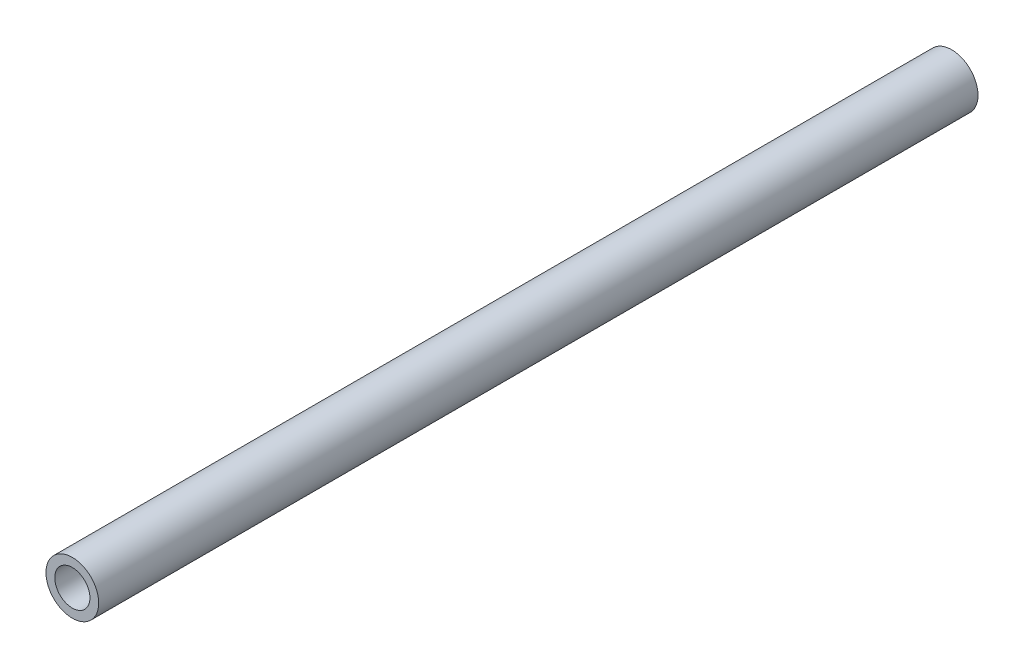
ISO-10303-21;
HEADER;
FILE_DESCRIPTION(('STEP AP214'),'2;1');
FILE_NAME('part.step','',(''),(''),'','','');
FILE_SCHEMA(('AUTOMOTIVE_DESIGN { 1 0 10303 214 1 1 1 1 }'));
ENDSEC;
DATA;
#1=APPLICATION_CONTEXT('core data for automotive mechanical design processes');
#2=APPLICATION_PROTOCOL_DEFINITION('international standard','automotive_design',2000,#1);
#3=PRODUCT_CONTEXT('',#1,'mechanical');
#4=PRODUCT('Part','Part','',(#3));
#5=PRODUCT_RELATED_PRODUCT_CATEGORY('part','',(#4));
#6=PRODUCT_DEFINITION_FORMATION('','',#4);
#7=PRODUCT_DEFINITION_CONTEXT('part definition',#1,'design');
#8=PRODUCT_DEFINITION('design','',#6,#7);
#9=PRODUCT_DEFINITION_SHAPE('','',#8);
#10=(LENGTH_UNIT() NAMED_UNIT(*) SI_UNIT(.MILLI.,.METRE.));
#11=(NAMED_UNIT(*) PLANE_ANGLE_UNIT() SI_UNIT($,.RADIAN.));
#12=(NAMED_UNIT(*) SI_UNIT($,.STERADIAN.) SOLID_ANGLE_UNIT());
#13=UNCERTAINTY_MEASURE_WITH_UNIT(LENGTH_MEASURE(1.E-05),#10,'distance_accuracy_value','');
#14=(GEOMETRIC_REPRESENTATION_CONTEXT(3) GLOBAL_UNCERTAINTY_ASSIGNED_CONTEXT((#13)) GLOBAL_UNIT_ASSIGNED_CONTEXT((#10,
#11,#12)) REPRESENTATION_CONTEXT('',''));
#15=CARTESIAN_POINT('',(0.,0.,0.));
#16=DIRECTION('',(0.,0.,1.));
#17=DIRECTION('',(1.,0.,0.));
#18=AXIS2_PLACEMENT_3D('',#15,#16,#17);
#19=CARTESIAN_POINT('',(0.,0.,100.));
#20=DIRECTION('',(0.,0.,1.));
#21=DIRECTION('',(1.,0.,0.));
#22=AXIS2_PLACEMENT_3D('',#19,#20,#21);
#23=PLANE('',#22);
#24=CARTESIAN_POINT('',(0.,0.,100.));
#25=DIRECTION('',(0.,0.,1.));
#26=DIRECTION('',(1.,0.,0.));
#27=AXIS2_PLACEMENT_3D('',#24,#25,#26);
#28=CIRCLE('',#27,3.);
#29=CARTESIAN_POINT('',(3.,0.,100.));
#30=VERTEX_POINT('',#29);
#31=EDGE_CURVE('E10',#30,#30,#28,.T.);
#32=ORIENTED_EDGE('',*,*,#31,.T.);
#33=EDGE_LOOP('',(#32));
#34=FACE_BOUND('',#33,.T.);
#35=CARTESIAN_POINT('',(0.,0.,100.));
#36=DIRECTION('',(0.,0.,1.));
#37=DIRECTION('',(1.,0.,0.));
#38=AXIS2_PLACEMENT_3D('',#35,#36,#37);
#39=CIRCLE('',#38,2.);
#40=CARTESIAN_POINT('',(2.,0.,100.));
#41=VERTEX_POINT('',#40);
#42=EDGE_CURVE('E54',#41,#41,#39,.T.);
#43=ORIENTED_EDGE('',*,*,#42,.F.);
#44=EDGE_LOOP('',(#43));
#45=FACE_BOUND('',#44,.T.);
#46=ADVANCED_FACE('F41',(#34,#45),#23,.T.);
#47=CARTESIAN_POINT('',(0.,0.,0.));
#48=DIRECTION('',(0.,0.,1.));
#49=DIRECTION('',(1.,0.,0.));
#50=AXIS2_PLACEMENT_3D('',#47,#48,#49);
#51=PLANE('',#50);
#52=CARTESIAN_POINT('',(0.,0.,0.));
#53=DIRECTION('',(0.,0.,1.));
#54=DIRECTION('',(1.,0.,0.));
#55=AXIS2_PLACEMENT_3D('',#52,#53,#54);
#56=CIRCLE('',#55,3.);
#57=CARTESIAN_POINT('',(3.,0.,0.));
#58=VERTEX_POINT('',#57);
#59=EDGE_CURVE('E45',#58,#58,#56,.T.);
#60=ORIENTED_EDGE('',*,*,#59,.F.);
#61=EDGE_LOOP('',(#60));
#62=FACE_BOUND('',#61,.T.);
#63=CARTESIAN_POINT('',(0.,0.,0.));
#64=DIRECTION('',(0.,0.,1.));
#65=DIRECTION('',(1.,0.,0.));
#66=AXIS2_PLACEMENT_3D('',#63,#64,#65);
#67=CIRCLE('',#66,2.);
#68=CARTESIAN_POINT('',(2.,0.,0.));
#69=VERTEX_POINT('',#68);
#70=EDGE_CURVE('E56',#69,#69,#67,.T.);
#71=ORIENTED_EDGE('',*,*,#70,.T.);
#72=EDGE_LOOP('',(#71));
#73=FACE_BOUND('',#72,.T.);
#74=ADVANCED_FACE('F68',(#62,#73),#51,.F.);
#75=CARTESIAN_POINT('',(0.,0.,100.));
#76=DIRECTION('',(0.,0.,-1.));
#77=DIRECTION('',(-1.,0.,0.));
#78=AXIS2_PLACEMENT_3D('',#75,#76,#77);
#79=CYLINDRICAL_SURFACE('',#78,3.);
#80=ORIENTED_EDGE('',*,*,#31,.F.);
#81=EDGE_LOOP('',(#80));
#82=FACE_BOUND('',#81,.T.);
#83=ORIENTED_EDGE('',*,*,#59,.T.);
#84=EDGE_LOOP('',(#83));
#85=FACE_BOUND('',#84,.T.);
#86=ADVANCED_FACE('F43',(#82,#85),#79,.T.);
#87=CARTESIAN_POINT('',(0.,0.,100.));
#88=DIRECTION('',(0.,0.,-1.));
#89=DIRECTION('',(-1.,0.,0.));
#90=AXIS2_PLACEMENT_3D('',#87,#88,#89);
#91=CYLINDRICAL_SURFACE('',#90,2.);
#92=ORIENTED_EDGE('',*,*,#42,.T.);
#93=EDGE_LOOP('',(#92));
#94=FACE_BOUND('',#93,.T.);
#95=ORIENTED_EDGE('',*,*,#70,.F.);
#96=EDGE_LOOP('',(#95));
#97=FACE_BOUND('',#96,.T.);
#98=ADVANCED_FACE('F64',(#94,#97),#91,.F.);
#99=CLOSED_SHELL('',(#46,#74,#86,#98));
#100=MANIFOLD_SOLID_BREP('B2',#99);
#101=ADVANCED_BREP_SHAPE_REPRESENTATION('',(#18,#100),#14);
#102=SHAPE_DEFINITION_REPRESENTATION(#9,#101);
ENDSEC;
END-ISO-10303-21;
